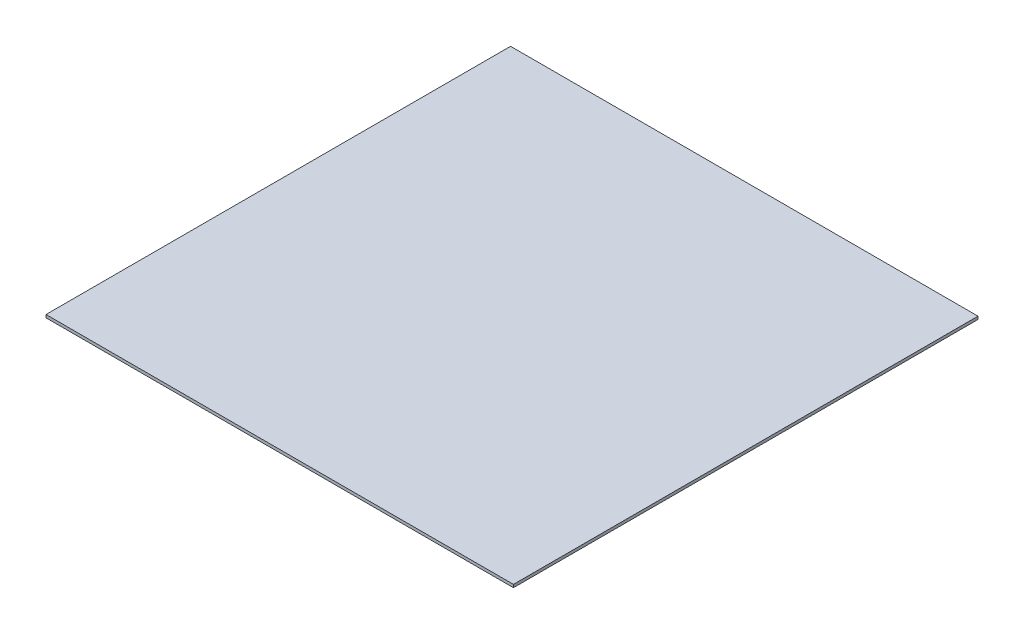
ISO-10303-21;
HEADER;
FILE_DESCRIPTION(('STEP AP214'),'2;1');
FILE_NAME('part.step','',(''),(''),'','','');
FILE_SCHEMA(('AUTOMOTIVE_DESIGN { 1 0 10303 214 1 1 1 1 }'));
ENDSEC;
DATA;
#1=APPLICATION_CONTEXT('core data for automotive mechanical design processes');
#2=APPLICATION_PROTOCOL_DEFINITION('international standard','automotive_design',2000,#1);
#3=PRODUCT_CONTEXT('',#1,'mechanical');
#4=PRODUCT('Part','Part','',(#3));
#5=PRODUCT_RELATED_PRODUCT_CATEGORY('part','',(#4));
#6=PRODUCT_DEFINITION_FORMATION('','',#4);
#7=PRODUCT_DEFINITION_CONTEXT('part definition',#1,'design');
#8=PRODUCT_DEFINITION('design','',#6,#7);
#9=PRODUCT_DEFINITION_SHAPE('','',#8);
#10=(LENGTH_UNIT() NAMED_UNIT(*) SI_UNIT(.MILLI.,.METRE.));
#11=(NAMED_UNIT(*) PLANE_ANGLE_UNIT() SI_UNIT($,.RADIAN.));
#12=(NAMED_UNIT(*) SI_UNIT($,.STERADIAN.) SOLID_ANGLE_UNIT());
#13=UNCERTAINTY_MEASURE_WITH_UNIT(LENGTH_MEASURE(1.E-05),#10,'distance_accuracy_value','');
#14=(GEOMETRIC_REPRESENTATION_CONTEXT(3) GLOBAL_UNCERTAINTY_ASSIGNED_CONTEXT((#13)) GLOBAL_UNIT_ASSIGNED_CONTEXT((#10,
#11,#12)) REPRESENTATION_CONTEXT('',''));
#15=CARTESIAN_POINT('',(0.,0.,0.));
#16=DIRECTION('',(0.,0.,1.));
#17=DIRECTION('',(1.,0.,0.));
#18=AXIS2_PLACEMENT_3D('',#15,#16,#17);
#19=CARTESIAN_POINT('',(257.175,1.5875,255.5875));
#20=DIRECTION('',(-1.,0.,0.));
#21=DIRECTION('',(0.,0.,1.));
#22=AXIS2_PLACEMENT_3D('',#19,#20,#21);
#23=PLANE('',#22);
#24=DIRECTION('',(0.,0.,-1.));
#25=VECTOR('',#24,1.);
#26=CARTESIAN_POINT('',(257.175,-1.5875,255.5875));
#27=LINE('',#26,#25);
#28=CARTESIAN_POINT('',(257.175,-1.5875,255.5875));
#29=VERTEX_POINT('',#28);
#30=CARTESIAN_POINT('',(257.175,-1.5875,-255.5875));
#31=VERTEX_POINT('',#30);
#32=EDGE_CURVE('E100',#29,#31,#27,.T.);
#33=ORIENTED_EDGE('',*,*,#32,.T.);
#34=DIRECTION('',(0.,-1.,0.));
#35=VECTOR('',#34,1.);
#36=CARTESIAN_POINT('',(257.175,1.5875,-255.5875));
#37=LINE('',#36,#35);
#38=CARTESIAN_POINT('',(257.175,1.5875,-255.5875));
#39=VERTEX_POINT('',#38);
#40=EDGE_CURVE('E11',#39,#31,#37,.T.);
#41=ORIENTED_EDGE('',*,*,#40,.F.);
#42=DIRECTION('',(0.,0.,-1.));
#43=VECTOR('',#42,1.);
#44=CARTESIAN_POINT('',(257.175,1.5875,255.5875));
#45=LINE('',#44,#43);
#46=CARTESIAN_POINT('',(257.175,1.5875,255.5875));
#47=VERTEX_POINT('',#46);
#48=EDGE_CURVE('E88',#47,#39,#45,.T.);
#49=ORIENTED_EDGE('',*,*,#48,.F.);
#50=DIRECTION('',(0.,-1.,0.));
#51=VECTOR('',#50,1.);
#52=CARTESIAN_POINT('',(257.175,1.5875,255.5875));
#53=LINE('',#52,#51);
#54=EDGE_CURVE('E96',#47,#29,#53,.T.);
#55=ORIENTED_EDGE('',*,*,#54,.T.);
#56=EDGE_LOOP('',(#33,#41,#49,#55));
#57=FACE_BOUND('',#56,.T.);
#58=ADVANCED_FACE('F37',(#57),#23,.F.);
#59=CARTESIAN_POINT('',(-257.175,1.5875,-255.5875));
#60=DIRECTION('',(0.,0.,1.));
#61=DIRECTION('',(1.,0.,0.));
#62=AXIS2_PLACEMENT_3D('',#59,#60,#61);
#63=PLANE('',#62);
#64=DIRECTION('',(-1.,0.,0.));
#65=VECTOR('',#64,1.);
#66=CARTESIAN_POINT('',(-257.175,-1.5875,-255.5875));
#67=LINE('',#66,#65);
#68=CARTESIAN_POINT('',(-257.175,-1.5875,-255.5875));
#69=VERTEX_POINT('',#68);
#70=EDGE_CURVE('E92',#31,#69,#67,.T.);
#71=ORIENTED_EDGE('',*,*,#70,.T.);
#72=DIRECTION('',(0.,-1.,0.));
#73=VECTOR('',#72,1.);
#74=CARTESIAN_POINT('',(-257.175,1.5875,-255.5875));
#75=LINE('',#74,#73);
#76=CARTESIAN_POINT('',(-257.175,1.5875,-255.5875));
#77=VERTEX_POINT('',#76);
#78=EDGE_CURVE('E45',#77,#69,#75,.T.);
#79=ORIENTED_EDGE('',*,*,#78,.F.);
#80=DIRECTION('',(-1.,0.,0.));
#81=VECTOR('',#80,1.);
#82=CARTESIAN_POINT('',(-257.175,1.5875,-255.5875));
#83=LINE('',#82,#81);
#84=EDGE_CURVE('E83',#39,#77,#83,.T.);
#85=ORIENTED_EDGE('',*,*,#84,.F.);
#86=ORIENTED_EDGE('',*,*,#40,.T.);
#87=EDGE_LOOP('',(#71,#79,#85,#86));
#88=FACE_BOUND('',#87,.T.);
#89=ADVANCED_FACE('F91',(#88),#63,.F.);
#90=CARTESIAN_POINT('',(-257.175,1.5875,255.5875));
#91=DIRECTION('',(1.,0.,0.));
#92=DIRECTION('',(0.,0.,-1.));
#93=AXIS2_PLACEMENT_3D('',#90,#91,#92);
#94=PLANE('',#93);
#95=DIRECTION('',(0.,0.,1.));
#96=VECTOR('',#95,1.);
#97=CARTESIAN_POINT('',(-257.175,-1.5875,255.5875));
#98=LINE('',#97,#96);
#99=CARTESIAN_POINT('',(-257.175,-1.5875,255.5875));
#100=VERTEX_POINT('',#99);
#101=EDGE_CURVE('E70',#69,#100,#98,.T.);
#102=ORIENTED_EDGE('',*,*,#101,.T.);
#103=DIRECTION('',(0.,-1.,0.));
#104=VECTOR('',#103,1.);
#105=CARTESIAN_POINT('',(-257.175,1.5875,255.5875));
#106=LINE('',#105,#104);
#107=CARTESIAN_POINT('',(-257.175,1.5875,255.5875));
#108=VERTEX_POINT('',#107);
#109=EDGE_CURVE('E93',#108,#100,#106,.T.);
#110=ORIENTED_EDGE('',*,*,#109,.F.);
#111=DIRECTION('',(0.,0.,1.));
#112=VECTOR('',#111,1.);
#113=CARTESIAN_POINT('',(-257.175,1.5875,255.5875));
#114=LINE('',#113,#112);
#115=EDGE_CURVE('E86',#77,#108,#114,.T.);
#116=ORIENTED_EDGE('',*,*,#115,.F.);
#117=ORIENTED_EDGE('',*,*,#78,.T.);
#118=EDGE_LOOP('',(#102,#110,#116,#117));
#119=FACE_BOUND('',#118,.T.);
#120=ADVANCED_FACE('F94',(#119),#94,.F.);
#121=CARTESIAN_POINT('',(-257.175,1.5875,255.5875));
#122=DIRECTION('',(0.,0.,-1.));
#123=DIRECTION('',(-1.,0.,0.));
#124=AXIS2_PLACEMENT_3D('',#121,#122,#123);
#125=PLANE('',#124);
#126=DIRECTION('',(1.,0.,0.));
#127=VECTOR('',#126,1.);
#128=CARTESIAN_POINT('',(-257.175,-1.5875,255.5875));
#129=LINE('',#128,#127);
#130=EDGE_CURVE('E76',#100,#29,#129,.T.);
#131=ORIENTED_EDGE('',*,*,#130,.T.);
#132=ORIENTED_EDGE('',*,*,#54,.F.);
#133=DIRECTION('',(1.,0.,0.));
#134=VECTOR('',#133,1.);
#135=CARTESIAN_POINT('',(-257.175,1.5875,255.5875));
#136=LINE('',#135,#134);
#137=EDGE_CURVE('E53',#108,#47,#136,.T.);
#138=ORIENTED_EDGE('',*,*,#137,.F.);
#139=ORIENTED_EDGE('',*,*,#109,.T.);
#140=EDGE_LOOP('',(#131,#132,#138,#139));
#141=FACE_BOUND('',#140,.T.);
#142=ADVANCED_FACE('F107',(#141),#125,.F.);
#143=CARTESIAN_POINT('',(0.,1.5875,0.));
#144=DIRECTION('',(0.,-1.,0.));
#145=DIRECTION('',(0.,0.,-1.));
#146=AXIS2_PLACEMENT_3D('',#143,#144,#145);
#147=PLANE('',#146);
#148=ORIENTED_EDGE('',*,*,#48,.T.);
#149=ORIENTED_EDGE('',*,*,#84,.T.);
#150=ORIENTED_EDGE('',*,*,#115,.T.);
#151=ORIENTED_EDGE('',*,*,#137,.T.);
#152=EDGE_LOOP('',(#148,#149,#150,#151));
#153=FACE_BOUND('',#152,.T.);
#154=ADVANCED_FACE('F84',(#153),#147,.F.);
#155=CARTESIAN_POINT('',(0.,-1.5875,0.));
#156=DIRECTION('',(0.,-1.,0.));
#157=DIRECTION('',(0.,0.,-1.));
#158=AXIS2_PLACEMENT_3D('',#155,#156,#157);
#159=PLANE('',#158);
#160=ORIENTED_EDGE('',*,*,#32,.F.);
#161=ORIENTED_EDGE('',*,*,#130,.F.);
#162=ORIENTED_EDGE('',*,*,#101,.F.);
#163=ORIENTED_EDGE('',*,*,#70,.F.);
#164=EDGE_LOOP('',(#160,#161,#162,#163));
#165=FACE_BOUND('',#164,.T.);
#166=ADVANCED_FACE('F110',(#165),#159,.T.);
#167=CLOSED_SHELL('',(#58,#89,#120,#142,#154,#166));
#168=MANIFOLD_SOLID_BREP('B2',#167);
#169=ADVANCED_BREP_SHAPE_REPRESENTATION('',(#18,#168),#14);
#170=SHAPE_DEFINITION_REPRESENTATION(#9,#169);
ENDSEC;
END-ISO-10303-21;
